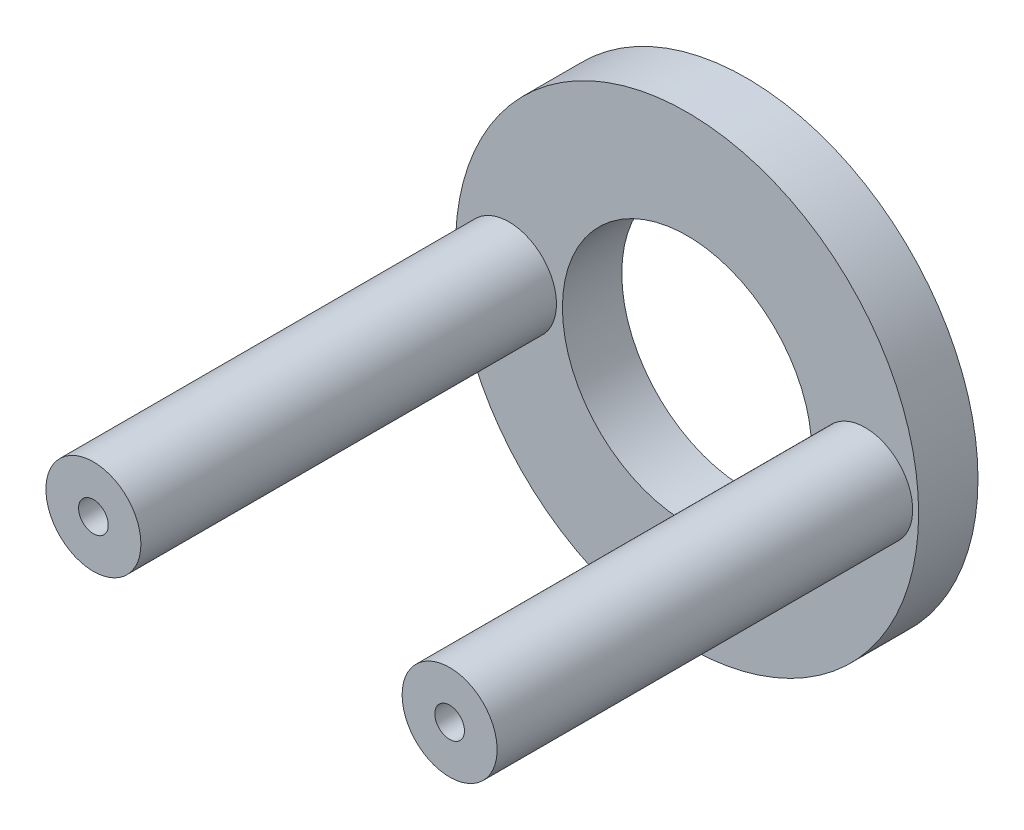
ISO-10303-21;
HEADER;
FILE_DESCRIPTION(('STEP AP214'),'2;1');
FILE_NAME('part.step','',(''),(''),'','','');
FILE_SCHEMA(('AUTOMOTIVE_DESIGN { 1 0 10303 214 1 1 1 1 }'));
ENDSEC;
DATA;
#1=APPLICATION_CONTEXT('core data for automotive mechanical design processes');
#2=APPLICATION_PROTOCOL_DEFINITION('international standard','automotive_design',2000,#1);
#3=PRODUCT_CONTEXT('',#1,'mechanical');
#4=PRODUCT('Part','Part','',(#3));
#5=PRODUCT_RELATED_PRODUCT_CATEGORY('part','',(#4));
#6=PRODUCT_DEFINITION_FORMATION('','',#4);
#7=PRODUCT_DEFINITION_CONTEXT('part definition',#1,'design');
#8=PRODUCT_DEFINITION('design','',#6,#7);
#9=PRODUCT_DEFINITION_SHAPE('','',#8);
#10=(LENGTH_UNIT() NAMED_UNIT(*) SI_UNIT(.MILLI.,.METRE.));
#11=(NAMED_UNIT(*) PLANE_ANGLE_UNIT() SI_UNIT($,.RADIAN.));
#12=(NAMED_UNIT(*) SI_UNIT($,.STERADIAN.) SOLID_ANGLE_UNIT());
#13=UNCERTAINTY_MEASURE_WITH_UNIT(LENGTH_MEASURE(1.E-05),#10,'distance_accuracy_value','');
#14=(GEOMETRIC_REPRESENTATION_CONTEXT(3) GLOBAL_UNCERTAINTY_ASSIGNED_CONTEXT((#13)) GLOBAL_UNIT_ASSIGNED_CONTEXT((#10,
#11,#12)) REPRESENTATION_CONTEXT('',''));
#15=CARTESIAN_POINT('',(0.,0.,0.));
#16=DIRECTION('',(0.,0.,1.));
#17=DIRECTION('',(1.,0.,0.));
#18=AXIS2_PLACEMENT_3D('',#15,#16,#17);
#19=CARTESIAN_POINT('',(0.,0.,5.));
#20=DIRECTION('',(0.,0.,1.));
#21=DIRECTION('',(1.,0.,0.));
#22=AXIS2_PLACEMENT_3D('',#19,#20,#21);
#23=PLANE('',#22);
#24=CARTESIAN_POINT('',(15.,0.,5.));
#25=DIRECTION('',(0.,0.,1.));
#26=DIRECTION('',(-1.,0.,0.));
#27=AXIS2_PLACEMENT_3D('',#24,#25,#26);
#28=CIRCLE('',#27,4.);
#29=CARTESIAN_POINT('',(11.,0.,5.));
#30=VERTEX_POINT('',#29);
#31=EDGE_CURVE('E56',#30,#30,#28,.T.);
#32=ORIENTED_EDGE('',*,*,#31,.F.);
#33=EDGE_LOOP('',(#32));
#34=FACE_BOUND('',#33,.T.);
#35=CARTESIAN_POINT('',(-15.,0.,5.));
#36=DIRECTION('',(0.,0.,1.));
#37=DIRECTION('',(1.,0.,0.));
#38=AXIS2_PLACEMENT_3D('',#35,#36,#37);
#39=CIRCLE('',#38,4.);
#40=CARTESIAN_POINT('',(-11.,0.,5.));
#41=VERTEX_POINT('',#40);
#42=EDGE_CURVE('E50',#41,#41,#39,.T.);
#43=ORIENTED_EDGE('',*,*,#42,.F.);
#44=EDGE_LOOP('',(#43));
#45=FACE_BOUND('',#44,.T.);
#46=CARTESIAN_POINT('',(0.,0.,5.));
#47=DIRECTION('',(0.,0.,1.));
#48=DIRECTION('',(1.,0.,0.));
#49=AXIS2_PLACEMENT_3D('',#46,#47,#48);
#50=CIRCLE('',#49,19.5);
#51=CARTESIAN_POINT('',(19.5,0.,5.));
#52=VERTEX_POINT('',#51);
#53=EDGE_CURVE('E10',#52,#52,#50,.T.);
#54=ORIENTED_EDGE('',*,*,#53,.T.);
#55=EDGE_LOOP('',(#54));
#56=FACE_BOUND('',#55,.T.);
#57=CARTESIAN_POINT('',(0.,0.,5.));
#58=DIRECTION('',(0.,0.,1.));
#59=DIRECTION('',(1.,0.,0.));
#60=AXIS2_PLACEMENT_3D('',#57,#58,#59);
#61=CIRCLE('',#60,10.5);
#62=CARTESIAN_POINT('',(10.5,0.,5.));
#63=VERTEX_POINT('',#62);
#64=EDGE_CURVE('E42',#63,#63,#61,.T.);
#65=ORIENTED_EDGE('',*,*,#64,.F.);
#66=EDGE_LOOP('',(#65));
#67=FACE_BOUND('',#66,.T.);
#68=ADVANCED_FACE('F31',(#34,#45,#56,#67),#23,.T.);
#69=CARTESIAN_POINT('',(0.,0.,0.));
#70=DIRECTION('',(0.,0.,1.));
#71=DIRECTION('',(1.,0.,0.));
#72=AXIS2_PLACEMENT_3D('',#69,#70,#71);
#73=PLANE('',#72);
#74=CARTESIAN_POINT('',(0.,0.,0.));
#75=DIRECTION('',(0.,0.,1.));
#76=DIRECTION('',(1.,0.,0.));
#77=AXIS2_PLACEMENT_3D('',#74,#75,#76);
#78=CIRCLE('',#77,19.5);
#79=CARTESIAN_POINT('',(19.5,0.,0.));
#80=VERTEX_POINT('',#79);
#81=EDGE_CURVE('E35',#80,#80,#78,.T.);
#82=ORIENTED_EDGE('',*,*,#81,.F.);
#83=EDGE_LOOP('',(#82));
#84=FACE_BOUND('',#83,.T.);
#85=CARTESIAN_POINT('',(0.,0.,0.));
#86=DIRECTION('',(0.,0.,1.));
#87=DIRECTION('',(1.,0.,0.));
#88=AXIS2_PLACEMENT_3D('',#85,#86,#87);
#89=CIRCLE('',#88,10.5);
#90=CARTESIAN_POINT('',(10.5,0.,0.));
#91=VERTEX_POINT('',#90);
#92=EDGE_CURVE('E44',#91,#91,#89,.T.);
#93=ORIENTED_EDGE('',*,*,#92,.T.);
#94=EDGE_LOOP('',(#93));
#95=FACE_BOUND('',#94,.T.);
#96=ADVANCED_FACE('F98',(#84,#95),#73,.F.);
#97=CARTESIAN_POINT('',(0.,0.,5.));
#98=DIRECTION('',(0.,0.,-1.));
#99=DIRECTION('',(-1.,0.,0.));
#100=AXIS2_PLACEMENT_3D('',#97,#98,#99);
#101=CYLINDRICAL_SURFACE('',#100,19.5);
#102=ORIENTED_EDGE('',*,*,#53,.F.);
#103=EDGE_LOOP('',(#102));
#104=FACE_BOUND('',#103,.T.);
#105=ORIENTED_EDGE('',*,*,#81,.T.);
#106=EDGE_LOOP('',(#105));
#107=FACE_BOUND('',#106,.T.);
#108=ADVANCED_FACE('F33',(#104,#107),#101,.T.);
#109=CARTESIAN_POINT('',(0.,0.,5.));
#110=DIRECTION('',(0.,0.,-1.));
#111=DIRECTION('',(-1.,0.,0.));
#112=AXIS2_PLACEMENT_3D('',#109,#110,#111);
#113=CYLINDRICAL_SURFACE('',#112,10.5);
#114=ORIENTED_EDGE('',*,*,#64,.T.);
#115=EDGE_LOOP('',(#114));
#116=FACE_BOUND('',#115,.T.);
#117=ORIENTED_EDGE('',*,*,#92,.F.);
#118=EDGE_LOOP('',(#117));
#119=FACE_BOUND('',#118,.T.);
#120=ADVANCED_FACE('F93',(#116,#119),#113,.F.);
#121=CARTESIAN_POINT('',(-15.,0.,40.));
#122=DIRECTION('',(0.,0.,-1.));
#123=DIRECTION('',(-1.,0.,0.));
#124=AXIS2_PLACEMENT_3D('',#121,#122,#123);
#125=CYLINDRICAL_SURFACE('',#124,4.);
#126=CARTESIAN_POINT('',(-15.,0.,40.));
#127=DIRECTION('',(0.,0.,1.));
#128=DIRECTION('',(1.,0.,0.));
#129=AXIS2_PLACEMENT_3D('',#126,#127,#128);
#130=CIRCLE('',#129,4.);
#131=CARTESIAN_POINT('',(-11.,0.,40.));
#132=VERTEX_POINT('',#131);
#133=EDGE_CURVE('E47',#132,#132,#130,.T.);
#134=ORIENTED_EDGE('',*,*,#133,.F.);
#135=EDGE_LOOP('',(#134));
#136=FACE_BOUND('',#135,.T.);
#137=ORIENTED_EDGE('',*,*,#42,.T.);
#138=EDGE_LOOP('',(#137));
#139=FACE_BOUND('',#138,.T.);
#140=ADVANCED_FACE('F87',(#136,#139),#125,.T.);
#141=CARTESIAN_POINT('',(-15.,0.,40.));
#142=DIRECTION('',(0.,0.,1.));
#143=DIRECTION('',(1.,0.,0.));
#144=AXIS2_PLACEMENT_3D('',#141,#142,#143);
#145=PLANE('',#144);
#146=CARTESIAN_POINT('',(-15.,0.,40.));
#147=DIRECTION('',(0.,0.,1.));
#148=DIRECTION('',(1.,0.,0.));
#149=AXIS2_PLACEMENT_3D('',#146,#147,#148);
#150=CIRCLE('',#149,1.25);
#151=CARTESIAN_POINT('',(-13.75,0.,40.));
#152=VERTEX_POINT('',#151);
#153=EDGE_CURVE('E68',#152,#152,#150,.T.);
#154=ORIENTED_EDGE('',*,*,#153,.F.);
#155=EDGE_LOOP('',(#154));
#156=FACE_BOUND('',#155,.T.);
#157=ORIENTED_EDGE('',*,*,#133,.T.);
#158=EDGE_LOOP('',(#157));
#159=FACE_BOUND('',#158,.T.);
#160=ADVANCED_FACE('F83',(#156,#159),#145,.T.);
#161=CARTESIAN_POINT('',(15.,0.,40.));
#162=DIRECTION('',(0.,0.,-1.));
#163=DIRECTION('',(-1.,0.,0.));
#164=AXIS2_PLACEMENT_3D('',#161,#162,#163);
#165=CYLINDRICAL_SURFACE('',#164,4.);
#166=CARTESIAN_POINT('',(15.,0.,40.));
#167=DIRECTION('',(0.,0.,1.));
#168=DIRECTION('',(-1.,0.,0.));
#169=AXIS2_PLACEMENT_3D('',#166,#167,#168);
#170=CIRCLE('',#169,4.);
#171=CARTESIAN_POINT('',(11.,0.,40.));
#172=VERTEX_POINT('',#171);
#173=EDGE_CURVE('E53',#172,#172,#170,.T.);
#174=ORIENTED_EDGE('',*,*,#173,.F.);
#175=EDGE_LOOP('',(#174));
#176=FACE_BOUND('',#175,.T.);
#177=ORIENTED_EDGE('',*,*,#31,.T.);
#178=EDGE_LOOP('',(#177));
#179=FACE_BOUND('',#178,.T.);
#180=ADVANCED_FACE('F86',(#176,#179),#165,.T.);
#181=CARTESIAN_POINT('',(15.,0.,40.));
#182=DIRECTION('',(0.,0.,-1.));
#183=DIRECTION('',(-1.,0.,0.));
#184=AXIS2_PLACEMENT_3D('',#181,#182,#183);
#185=PLANE('',#184);
#186=CARTESIAN_POINT('',(15.,0.,40.));
#187=DIRECTION('',(0.,0.,1.));
#188=DIRECTION('',(1.,0.,0.));
#189=AXIS2_PLACEMENT_3D('',#186,#187,#188);
#190=CIRCLE('',#189,1.25);
#191=CARTESIAN_POINT('',(16.25,0.,40.));
#192=VERTEX_POINT('',#191);
#193=EDGE_CURVE('E62',#192,#192,#190,.T.);
#194=ORIENTED_EDGE('',*,*,#193,.F.);
#195=EDGE_LOOP('',(#194));
#196=FACE_BOUND('',#195,.T.);
#197=ORIENTED_EDGE('',*,*,#173,.T.);
#198=EDGE_LOOP('',(#197));
#199=FACE_BOUND('',#198,.T.);
#200=ADVANCED_FACE('F119',(#196,#199),#185,.F.);
#201=CARTESIAN_POINT('',(15.,0.,33.));
#202=DIRECTION('',(0.,0.,1.));
#203=DIRECTION('',(1.,0.,0.));
#204=AXIS2_PLACEMENT_3D('',#201,#202,#203);
#205=CYLINDRICAL_SURFACE('',#204,1.25);
#206=CARTESIAN_POINT('',(15.,0.,33.));
#207=DIRECTION('',(0.,0.,1.));
#208=DIRECTION('',(1.,0.,0.));
#209=AXIS2_PLACEMENT_3D('',#206,#207,#208);
#210=CIRCLE('',#209,1.25);
#211=CARTESIAN_POINT('',(16.25,0.,33.));
#212=VERTEX_POINT('',#211);
#213=EDGE_CURVE('E59',#212,#212,#210,.T.);
#214=ORIENTED_EDGE('',*,*,#213,.F.);
#215=EDGE_LOOP('',(#214));
#216=FACE_BOUND('',#215,.T.);
#217=ORIENTED_EDGE('',*,*,#193,.T.);
#218=EDGE_LOOP('',(#217));
#219=FACE_BOUND('',#218,.T.);
#220=ADVANCED_FACE('F123',(#216,#219),#205,.F.);
#221=CARTESIAN_POINT('',(15.,0.,33.));
#222=DIRECTION('',(0.,0.,1.));
#223=DIRECTION('',(1.,0.,0.));
#224=AXIS2_PLACEMENT_3D('',#221,#222,#223);
#225=PLANE('',#224);
#226=ORIENTED_EDGE('',*,*,#213,.T.);
#227=EDGE_LOOP('',(#226));
#228=FACE_BOUND('',#227,.T.);
#229=ADVANCED_FACE('F79',(#228),#225,.T.);
#230=CARTESIAN_POINT('',(-15.,0.,33.));
#231=DIRECTION('',(0.,0.,1.));
#232=DIRECTION('',(1.,0.,0.));
#233=AXIS2_PLACEMENT_3D('',#230,#231,#232);
#234=CYLINDRICAL_SURFACE('',#233,1.25);
#235=CARTESIAN_POINT('',(-15.,0.,33.));
#236=DIRECTION('',(0.,0.,1.));
#237=DIRECTION('',(1.,0.,0.));
#238=AXIS2_PLACEMENT_3D('',#235,#236,#237);
#239=CIRCLE('',#238,1.25);
#240=CARTESIAN_POINT('',(-13.75,0.,33.));
#241=VERTEX_POINT('',#240);
#242=EDGE_CURVE('E65',#241,#241,#239,.T.);
#243=ORIENTED_EDGE('',*,*,#242,.F.);
#244=EDGE_LOOP('',(#243));
#245=FACE_BOUND('',#244,.T.);
#246=ORIENTED_EDGE('',*,*,#153,.T.);
#247=EDGE_LOOP('',(#246));
#248=FACE_BOUND('',#247,.T.);
#249=ADVANCED_FACE('F76',(#245,#248),#234,.F.);
#250=CARTESIAN_POINT('',(-15.,0.,33.));
#251=DIRECTION('',(0.,0.,1.));
#252=DIRECTION('',(1.,0.,0.));
#253=AXIS2_PLACEMENT_3D('',#250,#251,#252);
#254=PLANE('',#253);
#255=ORIENTED_EDGE('',*,*,#242,.T.);
#256=EDGE_LOOP('',(#255));
#257=FACE_BOUND('',#256,.T.);
#258=ADVANCED_FACE('F74',(#257),#254,.T.);
#259=CLOSED_SHELL('',(#68,#96,#108,#120,#140,#160,#180,#200,#220,#229,#249,#258));
#260=MANIFOLD_SOLID_BREP('B2',#259);
#261=ADVANCED_BREP_SHAPE_REPRESENTATION('',(#18,#260),#14);
#262=SHAPE_DEFINITION_REPRESENTATION(#9,#261);
ENDSEC;
END-ISO-10303-21;
